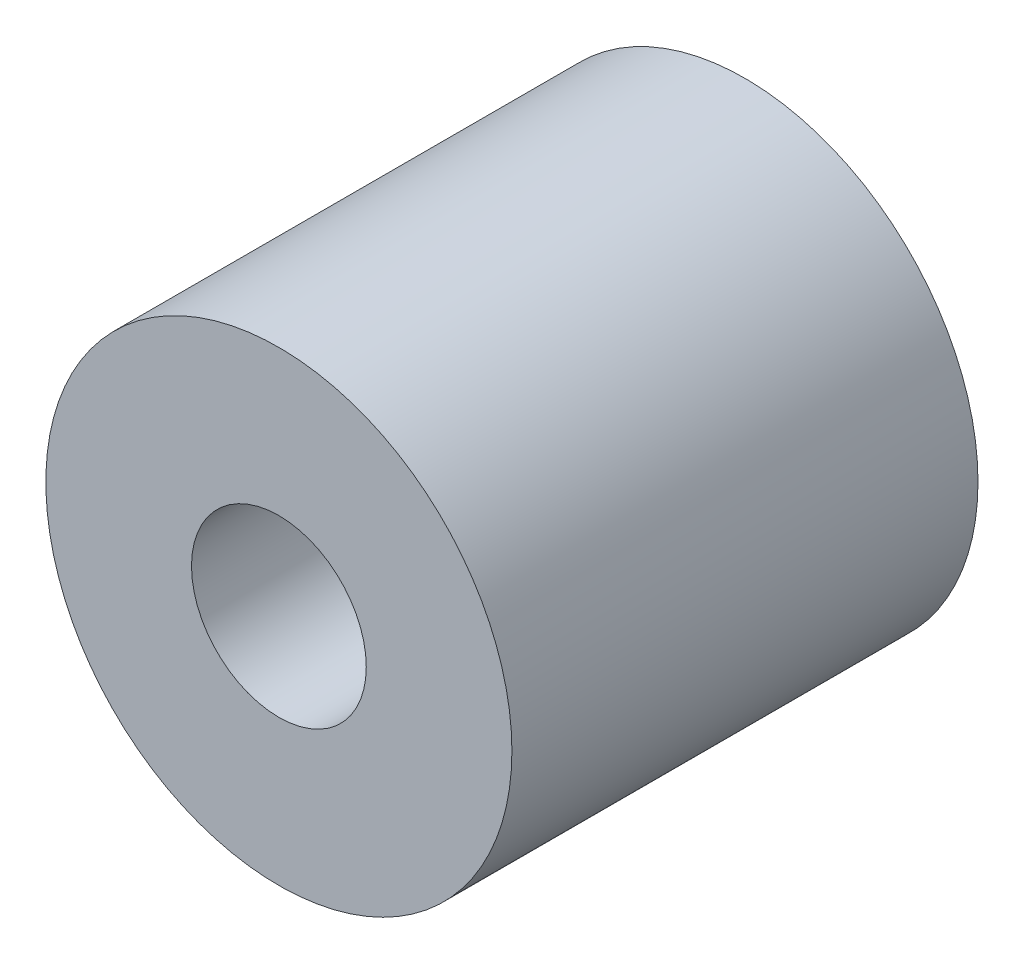
ISO-10303-21;
HEADER;
FILE_DESCRIPTION(('STEP AP214'),'2;1');
FILE_NAME('part.step','',(''),(''),'','','');
FILE_SCHEMA(('AUTOMOTIVE_DESIGN { 1 0 10303 214 1 1 1 1 }'));
ENDSEC;
DATA;
#1=APPLICATION_CONTEXT('core data for automotive mechanical design processes');
#2=APPLICATION_PROTOCOL_DEFINITION('international standard','automotive_design',2000,#1);
#3=PRODUCT_CONTEXT('',#1,'mechanical');
#4=PRODUCT('Part','Part','',(#3));
#5=PRODUCT_RELATED_PRODUCT_CATEGORY('part','',(#4));
#6=PRODUCT_DEFINITION_FORMATION('','',#4);
#7=PRODUCT_DEFINITION_CONTEXT('part definition',#1,'design');
#8=PRODUCT_DEFINITION('design','',#6,#7);
#9=PRODUCT_DEFINITION_SHAPE('','',#8);
#10=(LENGTH_UNIT() NAMED_UNIT(*) SI_UNIT(.MILLI.,.METRE.));
#11=(NAMED_UNIT(*) PLANE_ANGLE_UNIT() SI_UNIT($,.RADIAN.));
#12=(NAMED_UNIT(*) SI_UNIT($,.STERADIAN.) SOLID_ANGLE_UNIT());
#13=UNCERTAINTY_MEASURE_WITH_UNIT(LENGTH_MEASURE(1.E-05),#10,'distance_accuracy_value','');
#14=(GEOMETRIC_REPRESENTATION_CONTEXT(3) GLOBAL_UNCERTAINTY_ASSIGNED_CONTEXT((#13)) GLOBAL_UNIT_ASSIGNED_CONTEXT((#10,
#11,#12)) REPRESENTATION_CONTEXT('',''));
#15=CARTESIAN_POINT('',(0.,0.,0.));
#16=DIRECTION('',(0.,0.,1.));
#17=DIRECTION('',(1.,0.,0.));
#18=AXIS2_PLACEMENT_3D('',#15,#16,#17);
#19=CARTESIAN_POINT('',(0.,0.,8.));
#20=DIRECTION('',(0.,0.,-1.));
#21=DIRECTION('',(-1.,0.,0.));
#22=AXIS2_PLACEMENT_3D('',#19,#20,#21);
#23=CYLINDRICAL_SURFACE('',#22,3.);
#24=CARTESIAN_POINT('',(0.,0.,0.));
#25=DIRECTION('',(0.,0.,1.));
#26=DIRECTION('',(1.,0.,0.));
#27=AXIS2_PLACEMENT_3D('',#24,#25,#26);
#28=CIRCLE('',#27,3.);
#29=CARTESIAN_POINT('',(3.,0.,0.));
#30=VERTEX_POINT('',#29);
#31=EDGE_CURVE('E47',#30,#30,#28,.T.);
#32=ORIENTED_EDGE('',*,*,#31,.F.);
#33=EDGE_LOOP('',(#32));
#34=FACE_BOUND('',#33,.T.);
#35=CARTESIAN_POINT('',(0.,0.,2.5));
#36=DIRECTION('',(0.,0.,1.));
#37=DIRECTION('',(1.,0.,0.));
#38=AXIS2_PLACEMENT_3D('',#35,#36,#37);
#39=CIRCLE('',#38,3.);
#40=CARTESIAN_POINT('',(3.,0.,2.5));
#41=VERTEX_POINT('',#40);
#42=EDGE_CURVE('E54',#41,#41,#39,.F.);
#43=ORIENTED_EDGE('',*,*,#42,.F.);
#44=EDGE_LOOP('',(#43));
#45=FACE_BOUND('',#44,.T.);
#46=ADVANCED_FACE('F36',(#34,#45),#23,.F.);
#47=CARTESIAN_POINT('',(0.,0.,8.));
#48=DIRECTION('',(0.,0.,1.));
#49=DIRECTION('',(1.,0.,0.));
#50=AXIS2_PLACEMENT_3D('',#47,#48,#49);
#51=PLANE('',#50);
#52=CARTESIAN_POINT('',(0.,0.,8.));
#53=DIRECTION('',(0.,0.,1.));
#54=DIRECTION('',(1.,0.,0.));
#55=AXIS2_PLACEMENT_3D('',#52,#53,#54);
#56=CIRCLE('',#55,4.);
#57=CARTESIAN_POINT('',(4.,0.,8.));
#58=VERTEX_POINT('',#57);
#59=EDGE_CURVE('E11',#58,#58,#56,.T.);
#60=ORIENTED_EDGE('',*,*,#59,.T.);
#61=EDGE_LOOP('',(#60));
#62=FACE_BOUND('',#61,.T.);
#63=CARTESIAN_POINT('',(0.,0.,8.));
#64=DIRECTION('',(0.,0.,1.));
#65=DIRECTION('',(1.,0.,0.));
#66=AXIS2_PLACEMENT_3D('',#63,#64,#65);
#67=CIRCLE('',#66,1.5);
#68=CARTESIAN_POINT('',(1.5,0.,8.));
#69=VERTEX_POINT('',#68);
#70=EDGE_CURVE('E55',#69,#69,#67,.T.);
#71=ORIENTED_EDGE('',*,*,#70,.F.);
#72=EDGE_LOOP('',(#71));
#73=FACE_BOUND('',#72,.T.);
#74=ADVANCED_FACE('F65',(#62,#73),#51,.T.);
#75=CARTESIAN_POINT('',(0.,0.,0.));
#76=DIRECTION('',(0.,0.,1.));
#77=DIRECTION('',(1.,0.,0.));
#78=AXIS2_PLACEMENT_3D('',#75,#76,#77);
#79=PLANE('',#78);
#80=CARTESIAN_POINT('',(0.,0.,0.));
#81=DIRECTION('',(0.,0.,1.));
#82=DIRECTION('',(1.,0.,0.));
#83=AXIS2_PLACEMENT_3D('',#80,#81,#82);
#84=CIRCLE('',#83,4.);
#85=CARTESIAN_POINT('',(4.,0.,0.));
#86=VERTEX_POINT('',#85);
#87=EDGE_CURVE('E40',#86,#86,#84,.T.);
#88=ORIENTED_EDGE('',*,*,#87,.F.);
#89=EDGE_LOOP('',(#88));
#90=FACE_BOUND('',#89,.T.);
#91=ORIENTED_EDGE('',*,*,#31,.T.);
#92=EDGE_LOOP('',(#91));
#93=FACE_BOUND('',#92,.T.);
#94=ADVANCED_FACE('F71',(#90,#93),#79,.F.);
#95=CARTESIAN_POINT('',(0.,0.,8.));
#96=DIRECTION('',(0.,0.,-1.));
#97=DIRECTION('',(-1.,0.,0.));
#98=AXIS2_PLACEMENT_3D('',#95,#96,#97);
#99=CYLINDRICAL_SURFACE('',#98,4.);
#100=ORIENTED_EDGE('',*,*,#59,.F.);
#101=EDGE_LOOP('',(#100));
#102=FACE_BOUND('',#101,.T.);
#103=ORIENTED_EDGE('',*,*,#87,.T.);
#104=EDGE_LOOP('',(#103));
#105=FACE_BOUND('',#104,.T.);
#106=ADVANCED_FACE('F38',(#102,#105),#99,.T.);
#107=CARTESIAN_POINT('',(0.,0.,-8.48528137423857));
#108=DIRECTION('',(0.,0.,1.));
#109=DIRECTION('',(1.,0.,0.));
#110=AXIS2_PLACEMENT_3D('',#107,#108,#109);
#111=CYLINDRICAL_SURFACE('',#110,1.5);
#112=CARTESIAN_POINT('',(0.,0.,2.5));
#113=DIRECTION('',(0.,0.,1.));
#114=DIRECTION('',(1.,0.,0.));
#115=AXIS2_PLACEMENT_3D('',#112,#113,#114);
#116=CIRCLE('',#115,1.5);
#117=CARTESIAN_POINT('',(1.5,0.,2.5));
#118=VERTEX_POINT('',#117);
#119=EDGE_CURVE('E51',#118,#118,#116,.F.);
#120=ORIENTED_EDGE('',*,*,#119,.T.);
#121=EDGE_LOOP('',(#120));
#122=FACE_BOUND('',#121,.T.);
#123=ORIENTED_EDGE('',*,*,#70,.T.);
#124=EDGE_LOOP('',(#123));
#125=FACE_BOUND('',#124,.T.);
#126=ADVANCED_FACE('F75',(#122,#125),#111,.F.);
#127=CARTESIAN_POINT('',(0.,0.,2.5));
#128=DIRECTION('',(0.,0.,1.));
#129=DIRECTION('',(1.,0.,0.));
#130=AXIS2_PLACEMENT_3D('',#127,#128,#129);
#131=PLANE('',#130);
#132=ORIENTED_EDGE('',*,*,#42,.T.);
#133=EDGE_LOOP('',(#132));
#134=FACE_BOUND('',#133,.T.);
#135=ORIENTED_EDGE('',*,*,#119,.F.);
#136=EDGE_LOOP('',(#135));
#137=FACE_BOUND('',#136,.T.);
#138=ADVANCED_FACE('F61',(#134,#137),#131,.F.);
#139=CLOSED_SHELL('',(#46,#74,#94,#106,#126,#138));
#140=MANIFOLD_SOLID_BREP('B2',#139);
#141=ADVANCED_BREP_SHAPE_REPRESENTATION('',(#18,#140),#14);
#142=SHAPE_DEFINITION_REPRESENTATION(#9,#141);
ENDSEC;
END-ISO-10303-21;
